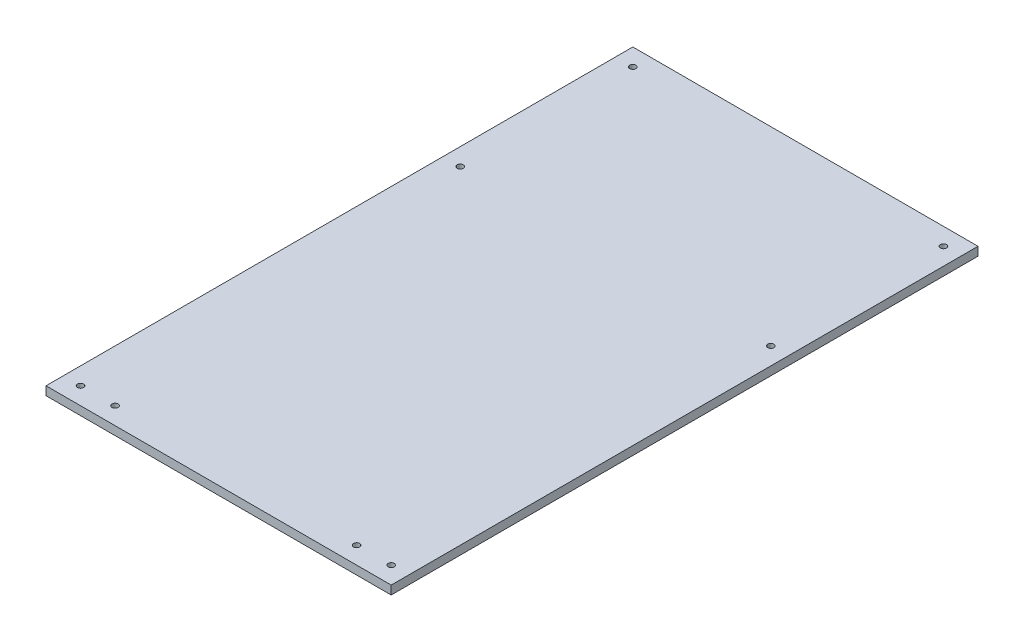
ISO-10303-21;
HEADER;
FILE_DESCRIPTION(('STEP AP214'),'2;1');
FILE_NAME('part.step','',(''),(''),'','','');
FILE_SCHEMA(('AUTOMOTIVE_DESIGN { 1 0 10303 214 1 1 1 1 }'));
ENDSEC;
DATA;
#1=APPLICATION_CONTEXT('core data for automotive mechanical design processes');
#2=APPLICATION_PROTOCOL_DEFINITION('international standard','automotive_design',2000,#1);
#3=PRODUCT_CONTEXT('',#1,'mechanical');
#4=PRODUCT('Part','Part','',(#3));
#5=PRODUCT_RELATED_PRODUCT_CATEGORY('part','',(#4));
#6=PRODUCT_DEFINITION_FORMATION('','',#4);
#7=PRODUCT_DEFINITION_CONTEXT('part definition',#1,'design');
#8=PRODUCT_DEFINITION('design','',#6,#7);
#9=PRODUCT_DEFINITION_SHAPE('','',#8);
#10=(LENGTH_UNIT() NAMED_UNIT(*) SI_UNIT(.MILLI.,.METRE.));
#11=(NAMED_UNIT(*) PLANE_ANGLE_UNIT() SI_UNIT($,.RADIAN.));
#12=(NAMED_UNIT(*) SI_UNIT($,.STERADIAN.) SOLID_ANGLE_UNIT());
#13=UNCERTAINTY_MEASURE_WITH_UNIT(LENGTH_MEASURE(1.E-05),#10,'distance_accuracy_value','');
#14=(GEOMETRIC_REPRESENTATION_CONTEXT(3) GLOBAL_UNCERTAINTY_ASSIGNED_CONTEXT((#13)) GLOBAL_UNIT_ASSIGNED_CONTEXT((#10,
#11,#12)) REPRESENTATION_CONTEXT('',''));
#15=CARTESIAN_POINT('',(0.,0.,0.));
#16=DIRECTION('',(0.,0.,1.));
#17=DIRECTION('',(1.,0.,0.));
#18=AXIS2_PLACEMENT_3D('',#15,#16,#17);
#19=CARTESIAN_POINT('',(0.,0.,0.));
#20=DIRECTION('',(0.,-1.,0.));
#21=DIRECTION('',(0.,0.,-1.));
#22=AXIS2_PLACEMENT_3D('',#19,#20,#21);
#23=PLANE('',#22);
#24=DIRECTION('',(0.,0.,1.));
#25=VECTOR('',#24,1.);
#26=CARTESIAN_POINT('',(0.,0.,0.));
#27=LINE('',#26,#25);
#28=CARTESIAN_POINT('',(0.,0.,-215.9));
#29=VERTEX_POINT('',#28);
#30=CARTESIAN_POINT('',(0.,0.,0.));
#31=VERTEX_POINT('',#30);
#32=EDGE_CURVE('E97',#29,#31,#27,.T.);
#33=ORIENTED_EDGE('',*,*,#32,.F.);
#34=DIRECTION('',(-1.,0.,0.));
#35=VECTOR('',#34,1.);
#36=CARTESIAN_POINT('',(0.,0.,-215.9));
#37=LINE('',#36,#35);
#38=CARTESIAN_POINT('',(127.,0.,-215.9));
#39=VERTEX_POINT('',#38);
#40=EDGE_CURVE('E73',#39,#29,#37,.T.);
#41=ORIENTED_EDGE('',*,*,#40,.F.);
#42=DIRECTION('',(0.,0.,-1.));
#43=VECTOR('',#42,1.);
#44=CARTESIAN_POINT('',(127.,0.,0.));
#45=LINE('',#44,#43);
#46=CARTESIAN_POINT('',(127.,0.,0.));
#47=VERTEX_POINT('',#46);
#48=EDGE_CURVE('E67',#47,#39,#45,.T.);
#49=ORIENTED_EDGE('',*,*,#48,.F.);
#50=DIRECTION('',(1.,0.,0.));
#51=VECTOR('',#50,1.);
#52=CARTESIAN_POINT('',(0.,0.,0.));
#53=LINE('',#52,#51);
#54=EDGE_CURVE('E89',#31,#47,#53,.T.);
#55=ORIENTED_EDGE('',*,*,#54,.F.);
#56=EDGE_LOOP('',(#33,#41,#49,#55));
#57=FACE_BOUND('',#56,.T.);
#58=CARTESIAN_POINT('',(107.950000000002,0.,-6.34999999999991));
#59=DIRECTION('',(0.,1.,0.));
#60=DIRECTION('',(0.,0.,1.));
#61=AXIS2_PLACEMENT_3D('',#58,#59,#60);
#62=CIRCLE('',#61,1.1303);
#63=CARTESIAN_POINT('',(107.950000000002,0.,-5.21969999999991));
#64=VERTEX_POINT('',#63);
#65=EDGE_CURVE('E100',#64,#64,#62,.T.);
#66=ORIENTED_EDGE('',*,*,#65,.T.);
#67=EDGE_LOOP('',(#66));
#68=FACE_BOUND('',#67,.T.);
#69=CARTESIAN_POINT('',(19.0500000000021,0.,-6.34999999999999));
#70=DIRECTION('',(0.,1.,0.));
#71=DIRECTION('',(0.,0.,1.));
#72=AXIS2_PLACEMENT_3D('',#69,#70,#71);
#73=CIRCLE('',#72,1.1303);
#74=CARTESIAN_POINT('',(19.0500000000021,0.,-5.21969999999999));
#75=VERTEX_POINT('',#74);
#76=EDGE_CURVE('E116',#75,#75,#73,.T.);
#77=ORIENTED_EDGE('',*,*,#76,.T.);
#78=EDGE_LOOP('',(#77));
#79=FACE_BOUND('',#78,.T.);
#80=CARTESIAN_POINT('',(6.35000000000213,0.,-6.34999999999999));
#81=DIRECTION('',(0.,1.,0.));
#82=DIRECTION('',(0.,0.,1.));
#83=AXIS2_PLACEMENT_3D('',#80,#81,#82);
#84=CIRCLE('',#83,1.1303);
#85=CARTESIAN_POINT('',(6.35000000000213,0.,-5.2197));
#86=VERTEX_POINT('',#85);
#87=EDGE_CURVE('E122',#86,#86,#84,.T.);
#88=ORIENTED_EDGE('',*,*,#87,.T.);
#89=EDGE_LOOP('',(#88));
#90=FACE_BOUND('',#89,.T.);
#91=CARTESIAN_POINT('',(120.650000000002,0.,-6.34999999999999));
#92=DIRECTION('',(0.,1.,0.));
#93=DIRECTION('',(0.,0.,1.));
#94=AXIS2_PLACEMENT_3D('',#91,#92,#93);
#95=CIRCLE('',#94,1.1303);
#96=CARTESIAN_POINT('',(120.650000000002,0.,-5.21969999999999));
#97=VERTEX_POINT('',#96);
#98=EDGE_CURVE('E128',#97,#97,#95,.T.);
#99=ORIENTED_EDGE('',*,*,#98,.T.);
#100=EDGE_LOOP('',(#99));
#101=FACE_BOUND('',#100,.T.);
#102=CARTESIAN_POINT('',(120.65,0.,-209.55));
#103=DIRECTION('',(0.,1.,0.));
#104=DIRECTION('',(0.,0.,1.));
#105=AXIS2_PLACEMENT_3D('',#102,#103,#104);
#106=CIRCLE('',#105,1.1303);
#107=CARTESIAN_POINT('',(120.65,0.,-208.4197));
#108=VERTEX_POINT('',#107);
#109=EDGE_CURVE('E134',#108,#108,#106,.T.);
#110=ORIENTED_EDGE('',*,*,#109,.T.);
#111=EDGE_LOOP('',(#110));
#112=FACE_BOUND('',#111,.T.);
#113=CARTESIAN_POINT('',(6.35000000000066,0.,-146.05));
#114=DIRECTION('',(0.,1.,0.));
#115=DIRECTION('',(0.,0.,1.));
#116=AXIS2_PLACEMENT_3D('',#113,#114,#115);
#117=CIRCLE('',#116,1.1303);
#118=CARTESIAN_POINT('',(6.35000000000066,0.,-144.9197));
#119=VERTEX_POINT('',#118);
#120=EDGE_CURVE('E140',#119,#119,#117,.T.);
#121=ORIENTED_EDGE('',*,*,#120,.T.);
#122=EDGE_LOOP('',(#121));
#123=FACE_BOUND('',#122,.T.);
#124=CARTESIAN_POINT('',(120.650000000001,0.,-146.05));
#125=DIRECTION('',(0.,1.,0.));
#126=DIRECTION('',(0.,0.,1.));
#127=AXIS2_PLACEMENT_3D('',#124,#125,#126);
#128=CIRCLE('',#127,1.1303);
#129=CARTESIAN_POINT('',(120.650000000001,0.,-144.9197));
#130=VERTEX_POINT('',#129);
#131=EDGE_CURVE('E146',#130,#130,#128,.T.);
#132=ORIENTED_EDGE('',*,*,#131,.T.);
#133=EDGE_LOOP('',(#132));
#134=FACE_BOUND('',#133,.T.);
#135=CARTESIAN_POINT('',(6.35,0.,-209.55));
#136=DIRECTION('',(0.,1.,0.));
#137=DIRECTION('',(0.,0.,1.));
#138=AXIS2_PLACEMENT_3D('',#135,#136,#137);
#139=CIRCLE('',#138,1.1303);
#140=CARTESIAN_POINT('',(6.35,0.,-208.4197));
#141=VERTEX_POINT('',#140);
#142=EDGE_CURVE('E152',#141,#141,#139,.T.);
#143=ORIENTED_EDGE('',*,*,#142,.T.);
#144=EDGE_LOOP('',(#143));
#145=FACE_BOUND('',#144,.T.);
#146=ADVANCED_FACE('F33',(#57,#68,#79,#90,#101,#112,#123,#134,#145),#23,.T.);
#147=CARTESIAN_POINT('',(0.,3.175,0.));
#148=DIRECTION('',(1.,0.,0.));
#149=DIRECTION('',(0.,0.,-1.));
#150=AXIS2_PLACEMENT_3D('',#147,#148,#149);
#151=PLANE('',#150);
#152=ORIENTED_EDGE('',*,*,#32,.T.);
#153=DIRECTION('',(0.,-1.,0.));
#154=VECTOR('',#153,1.);
#155=CARTESIAN_POINT('',(0.,3.175,0.));
#156=LINE('',#155,#154);
#157=CARTESIAN_POINT('',(0.,3.175,0.));
#158=VERTEX_POINT('',#157);
#159=EDGE_CURVE('E11',#158,#31,#156,.T.);
#160=ORIENTED_EDGE('',*,*,#159,.F.);
#161=DIRECTION('',(0.,0.,1.));
#162=VECTOR('',#161,1.);
#163=CARTESIAN_POINT('',(0.,3.175,0.));
#164=LINE('',#163,#162);
#165=CARTESIAN_POINT('',(0.,3.175,-215.9));
#166=VERTEX_POINT('',#165);
#167=EDGE_CURVE('E85',#166,#158,#164,.T.);
#168=ORIENTED_EDGE('',*,*,#167,.F.);
#169=DIRECTION('',(0.,-1.,0.));
#170=VECTOR('',#169,1.);
#171=CARTESIAN_POINT('',(0.,3.175,-215.9));
#172=LINE('',#171,#170);
#173=EDGE_CURVE('E93',#166,#29,#172,.T.);
#174=ORIENTED_EDGE('',*,*,#173,.T.);
#175=EDGE_LOOP('',(#152,#160,#168,#174));
#176=FACE_BOUND('',#175,.T.);
#177=ADVANCED_FACE('F35',(#176),#151,.F.);
#178=CARTESIAN_POINT('',(0.,3.175,0.));
#179=DIRECTION('',(0.,0.,-1.));
#180=DIRECTION('',(-1.,0.,0.));
#181=AXIS2_PLACEMENT_3D('',#178,#179,#180);
#182=PLANE('',#181);
#183=ORIENTED_EDGE('',*,*,#54,.T.);
#184=DIRECTION('',(0.,-1.,0.));
#185=VECTOR('',#184,1.);
#186=CARTESIAN_POINT('',(127.,3.175,0.));
#187=LINE('',#186,#185);
#188=CARTESIAN_POINT('',(127.,3.175,0.));
#189=VERTEX_POINT('',#188);
#190=EDGE_CURVE('E42',#189,#47,#187,.T.);
#191=ORIENTED_EDGE('',*,*,#190,.F.);
#192=DIRECTION('',(1.,0.,0.));
#193=VECTOR('',#192,1.);
#194=CARTESIAN_POINT('',(0.,3.175,0.));
#195=LINE('',#194,#193);
#196=EDGE_CURVE('E80',#158,#189,#195,.T.);
#197=ORIENTED_EDGE('',*,*,#196,.F.);
#198=ORIENTED_EDGE('',*,*,#159,.T.);
#199=EDGE_LOOP('',(#183,#191,#197,#198));
#200=FACE_BOUND('',#199,.T.);
#201=ADVANCED_FACE('F88',(#200),#182,.F.);
#202=CARTESIAN_POINT('',(127.,3.175,0.));
#203=DIRECTION('',(-1.,0.,0.));
#204=DIRECTION('',(0.,0.,1.));
#205=AXIS2_PLACEMENT_3D('',#202,#203,#204);
#206=PLANE('',#205);
#207=ORIENTED_EDGE('',*,*,#48,.T.);
#208=DIRECTION('',(0.,-1.,0.));
#209=VECTOR('',#208,1.);
#210=CARTESIAN_POINT('',(127.,3.175,-215.9));
#211=LINE('',#210,#209);
#212=CARTESIAN_POINT('',(127.,3.175,-215.9));
#213=VERTEX_POINT('',#212);
#214=EDGE_CURVE('E90',#213,#39,#211,.T.);
#215=ORIENTED_EDGE('',*,*,#214,.F.);
#216=DIRECTION('',(0.,0.,-1.));
#217=VECTOR('',#216,1.);
#218=CARTESIAN_POINT('',(127.,3.175,0.));
#219=LINE('',#218,#217);
#220=EDGE_CURVE('E83',#189,#213,#219,.T.);
#221=ORIENTED_EDGE('',*,*,#220,.F.);
#222=ORIENTED_EDGE('',*,*,#190,.T.);
#223=EDGE_LOOP('',(#207,#215,#221,#222));
#224=FACE_BOUND('',#223,.T.);
#225=ADVANCED_FACE('F91',(#224),#206,.F.);
#226=CARTESIAN_POINT('',(0.,3.175,-215.9));
#227=DIRECTION('',(0.,0.,1.));
#228=DIRECTION('',(1.,0.,0.));
#229=AXIS2_PLACEMENT_3D('',#226,#227,#228);
#230=PLANE('',#229);
#231=ORIENTED_EDGE('',*,*,#40,.T.);
#232=ORIENTED_EDGE('',*,*,#173,.F.);
#233=DIRECTION('',(-1.,0.,0.));
#234=VECTOR('',#233,1.);
#235=CARTESIAN_POINT('',(0.,3.175,-215.9));
#236=LINE('',#235,#234);
#237=EDGE_CURVE('E50',#213,#166,#236,.T.);
#238=ORIENTED_EDGE('',*,*,#237,.F.);
#239=ORIENTED_EDGE('',*,*,#214,.T.);
#240=EDGE_LOOP('',(#231,#232,#238,#239));
#241=FACE_BOUND('',#240,.T.);
#242=ADVANCED_FACE('F105',(#241),#230,.F.);
#243=CARTESIAN_POINT('',(0.,3.175,0.));
#244=DIRECTION('',(0.,-1.,0.));
#245=DIRECTION('',(0.,0.,-1.));
#246=AXIS2_PLACEMENT_3D('',#243,#244,#245);
#247=PLANE('',#246);
#248=CARTESIAN_POINT('',(6.35,3.175,-209.55));
#249=DIRECTION('',(0.,1.,0.));
#250=DIRECTION('',(0.,0.,1.));
#251=AXIS2_PLACEMENT_3D('',#248,#249,#250);
#252=CIRCLE('',#251,1.1303);
#253=CARTESIAN_POINT('',(6.35,3.175,-208.4197));
#254=VERTEX_POINT('',#253);
#255=EDGE_CURVE('E155',#254,#254,#252,.T.);
#256=ORIENTED_EDGE('',*,*,#255,.F.);
#257=EDGE_LOOP('',(#256));
#258=FACE_BOUND('',#257,.T.);
#259=CARTESIAN_POINT('',(120.650000000001,3.175,-146.05));
#260=DIRECTION('',(0.,1.,0.));
#261=DIRECTION('',(0.,0.,1.));
#262=AXIS2_PLACEMENT_3D('',#259,#260,#261);
#263=CIRCLE('',#262,1.1303);
#264=CARTESIAN_POINT('',(120.650000000001,3.175,-144.9197));
#265=VERTEX_POINT('',#264);
#266=EDGE_CURVE('E149',#265,#265,#263,.T.);
#267=ORIENTED_EDGE('',*,*,#266,.F.);
#268=EDGE_LOOP('',(#267));
#269=FACE_BOUND('',#268,.T.);
#270=CARTESIAN_POINT('',(6.35000000000066,3.175,-146.05));
#271=DIRECTION('',(0.,1.,0.));
#272=DIRECTION('',(0.,0.,1.));
#273=AXIS2_PLACEMENT_3D('',#270,#271,#272);
#274=CIRCLE('',#273,1.1303);
#275=CARTESIAN_POINT('',(6.35000000000066,3.175,-144.9197));
#276=VERTEX_POINT('',#275);
#277=EDGE_CURVE('E143',#276,#276,#274,.T.);
#278=ORIENTED_EDGE('',*,*,#277,.F.);
#279=EDGE_LOOP('',(#278));
#280=FACE_BOUND('',#279,.T.);
#281=CARTESIAN_POINT('',(120.65,3.175,-209.55));
#282=DIRECTION('',(0.,1.,0.));
#283=DIRECTION('',(0.,0.,1.));
#284=AXIS2_PLACEMENT_3D('',#281,#282,#283);
#285=CIRCLE('',#284,1.1303);
#286=CARTESIAN_POINT('',(120.65,3.175,-208.4197));
#287=VERTEX_POINT('',#286);
#288=EDGE_CURVE('E137',#287,#287,#285,.T.);
#289=ORIENTED_EDGE('',*,*,#288,.F.);
#290=EDGE_LOOP('',(#289));
#291=FACE_BOUND('',#290,.T.);
#292=CARTESIAN_POINT('',(120.650000000002,3.175,-6.34999999999999));
#293=DIRECTION('',(0.,1.,0.));
#294=DIRECTION('',(0.,0.,1.));
#295=AXIS2_PLACEMENT_3D('',#292,#293,#294);
#296=CIRCLE('',#295,1.1303);
#297=CARTESIAN_POINT('',(120.650000000002,3.175,-5.21969999999999));
#298=VERTEX_POINT('',#297);
#299=EDGE_CURVE('E131',#298,#298,#296,.T.);
#300=ORIENTED_EDGE('',*,*,#299,.F.);
#301=EDGE_LOOP('',(#300));
#302=FACE_BOUND('',#301,.T.);
#303=CARTESIAN_POINT('',(6.35000000000213,3.175,-6.34999999999999));
#304=DIRECTION('',(0.,1.,0.));
#305=DIRECTION('',(0.,0.,1.));
#306=AXIS2_PLACEMENT_3D('',#303,#304,#305);
#307=CIRCLE('',#306,1.1303);
#308=CARTESIAN_POINT('',(6.35000000000213,3.175,-5.2197));
#309=VERTEX_POINT('',#308);
#310=EDGE_CURVE('E125',#309,#309,#307,.T.);
#311=ORIENTED_EDGE('',*,*,#310,.F.);
#312=EDGE_LOOP('',(#311));
#313=FACE_BOUND('',#312,.T.);
#314=CARTESIAN_POINT('',(19.0500000000021,3.175,-6.34999999999999));
#315=DIRECTION('',(0.,1.,0.));
#316=DIRECTION('',(0.,0.,1.));
#317=AXIS2_PLACEMENT_3D('',#314,#315,#316);
#318=CIRCLE('',#317,1.1303);
#319=CARTESIAN_POINT('',(19.0500000000021,3.175,-5.2197));
#320=VERTEX_POINT('',#319);
#321=EDGE_CURVE('E119',#320,#320,#318,.T.);
#322=ORIENTED_EDGE('',*,*,#321,.F.);
#323=EDGE_LOOP('',(#322));
#324=FACE_BOUND('',#323,.T.);
#325=CARTESIAN_POINT('',(107.950000000002,3.175,-6.34999999999991));
#326=DIRECTION('',(0.,1.,0.));
#327=DIRECTION('',(0.,0.,1.));
#328=AXIS2_PLACEMENT_3D('',#325,#326,#327);
#329=CIRCLE('',#328,1.1303);
#330=CARTESIAN_POINT('',(107.950000000002,3.175,-5.21969999999991));
#331=VERTEX_POINT('',#330);
#332=EDGE_CURVE('E113',#331,#331,#329,.T.);
#333=ORIENTED_EDGE('',*,*,#332,.F.);
#334=EDGE_LOOP('',(#333));
#335=FACE_BOUND('',#334,.T.);
#336=ORIENTED_EDGE('',*,*,#167,.T.);
#337=ORIENTED_EDGE('',*,*,#196,.T.);
#338=ORIENTED_EDGE('',*,*,#220,.T.);
#339=ORIENTED_EDGE('',*,*,#237,.T.);
#340=EDGE_LOOP('',(#336,#337,#338,#339));
#341=FACE_BOUND('',#340,.T.);
#342=ADVANCED_FACE('F81',(#258,#269,#280,#291,#302,#313,#324,#335,#341),#247,.F.);
#343=CARTESIAN_POINT('',(107.950000000002,3.175,-6.34999999999991));
#344=DIRECTION('',(0.,1.,0.));
#345=DIRECTION('',(0.,0.,1.));
#346=AXIS2_PLACEMENT_3D('',#343,#344,#345);
#347=CYLINDRICAL_SURFACE('',#346,1.1303);
#348=ORIENTED_EDGE('',*,*,#65,.F.);
#349=EDGE_LOOP('',(#348));
#350=FACE_BOUND('',#349,.T.);
#351=ORIENTED_EDGE('',*,*,#332,.T.);
#352=EDGE_LOOP('',(#351));
#353=FACE_BOUND('',#352,.T.);
#354=ADVANCED_FACE('F163',(#350,#353),#347,.F.);
#355=CARTESIAN_POINT('',(19.0500000000021,3.175,-6.34999999999999));
#356=DIRECTION('',(0.,1.,0.));
#357=DIRECTION('',(0.,0.,1.));
#358=AXIS2_PLACEMENT_3D('',#355,#356,#357);
#359=CYLINDRICAL_SURFACE('',#358,1.1303);
#360=ORIENTED_EDGE('',*,*,#76,.F.);
#361=EDGE_LOOP('',(#360));
#362=FACE_BOUND('',#361,.T.);
#363=ORIENTED_EDGE('',*,*,#321,.T.);
#364=EDGE_LOOP('',(#363));
#365=FACE_BOUND('',#364,.T.);
#366=ADVANCED_FACE('F180',(#362,#365),#359,.F.);
#367=CARTESIAN_POINT('',(6.35000000000213,3.175,-6.34999999999999));
#368=DIRECTION('',(0.,1.,0.));
#369=DIRECTION('',(0.,0.,1.));
#370=AXIS2_PLACEMENT_3D('',#367,#368,#369);
#371=CYLINDRICAL_SURFACE('',#370,1.1303);
#372=ORIENTED_EDGE('',*,*,#87,.F.);
#373=EDGE_LOOP('',(#372));
#374=FACE_BOUND('',#373,.T.);
#375=ORIENTED_EDGE('',*,*,#310,.T.);
#376=EDGE_LOOP('',(#375));
#377=FACE_BOUND('',#376,.T.);
#378=ADVANCED_FACE('F187',(#374,#377),#371,.F.);
#379=CARTESIAN_POINT('',(120.650000000002,3.175,-6.34999999999999));
#380=DIRECTION('',(0.,1.,0.));
#381=DIRECTION('',(0.,0.,1.));
#382=AXIS2_PLACEMENT_3D('',#379,#380,#381);
#383=CYLINDRICAL_SURFACE('',#382,1.1303);
#384=ORIENTED_EDGE('',*,*,#98,.F.);
#385=EDGE_LOOP('',(#384));
#386=FACE_BOUND('',#385,.T.);
#387=ORIENTED_EDGE('',*,*,#299,.T.);
#388=EDGE_LOOP('',(#387));
#389=FACE_BOUND('',#388,.T.);
#390=ADVANCED_FACE('F239',(#386,#389),#383,.F.);
#391=CARTESIAN_POINT('',(120.65,3.175,-209.55));
#392=DIRECTION('',(0.,1.,0.));
#393=DIRECTION('',(0.,0.,1.));
#394=AXIS2_PLACEMENT_3D('',#391,#392,#393);
#395=CYLINDRICAL_SURFACE('',#394,1.1303);
#396=ORIENTED_EDGE('',*,*,#109,.F.);
#397=EDGE_LOOP('',(#396));
#398=FACE_BOUND('',#397,.T.);
#399=ORIENTED_EDGE('',*,*,#288,.T.);
#400=EDGE_LOOP('',(#399));
#401=FACE_BOUND('',#400,.T.);
#402=ADVANCED_FACE('F248',(#398,#401),#395,.F.);
#403=CARTESIAN_POINT('',(6.35000000000066,3.175,-146.05));
#404=DIRECTION('',(0.,1.,0.));
#405=DIRECTION('',(0.,0.,1.));
#406=AXIS2_PLACEMENT_3D('',#403,#404,#405);
#407=CYLINDRICAL_SURFACE('',#406,1.1303);
#408=ORIENTED_EDGE('',*,*,#120,.F.);
#409=EDGE_LOOP('',(#408));
#410=FACE_BOUND('',#409,.T.);
#411=ORIENTED_EDGE('',*,*,#277,.T.);
#412=EDGE_LOOP('',(#411));
#413=FACE_BOUND('',#412,.T.);
#414=ADVANCED_FACE('F257',(#410,#413),#407,.F.);
#415=CARTESIAN_POINT('',(120.650000000001,3.175,-146.05));
#416=DIRECTION('',(0.,1.,0.));
#417=DIRECTION('',(0.,0.,1.));
#418=AXIS2_PLACEMENT_3D('',#415,#416,#417);
#419=CYLINDRICAL_SURFACE('',#418,1.1303);
#420=ORIENTED_EDGE('',*,*,#131,.F.);
#421=EDGE_LOOP('',(#420));
#422=FACE_BOUND('',#421,.T.);
#423=ORIENTED_EDGE('',*,*,#266,.T.);
#424=EDGE_LOOP('',(#423));
#425=FACE_BOUND('',#424,.T.);
#426=ADVANCED_FACE('F266',(#422,#425),#419,.F.);
#427=CARTESIAN_POINT('',(6.35,3.175,-209.55));
#428=DIRECTION('',(0.,1.,0.));
#429=DIRECTION('',(0.,0.,1.));
#430=AXIS2_PLACEMENT_3D('',#427,#428,#429);
#431=CYLINDRICAL_SURFACE('',#430,1.1303);
#432=ORIENTED_EDGE('',*,*,#142,.F.);
#433=EDGE_LOOP('',(#432));
#434=FACE_BOUND('',#433,.T.);
#435=ORIENTED_EDGE('',*,*,#255,.T.);
#436=EDGE_LOOP('',(#435));
#437=FACE_BOUND('',#436,.T.);
#438=ADVANCED_FACE('F159',(#434,#437),#431,.F.);
#439=CLOSED_SHELL('',(#146,#177,#201,#225,#242,#342,#354,#366,#378,#390,#402,#414,#426,#438));
#440=MANIFOLD_SOLID_BREP('B2',#439);
#441=ADVANCED_BREP_SHAPE_REPRESENTATION('',(#18,#440),#14);
#442=SHAPE_DEFINITION_REPRESENTATION(#9,#441);
ENDSEC;
END-ISO-10303-21;
